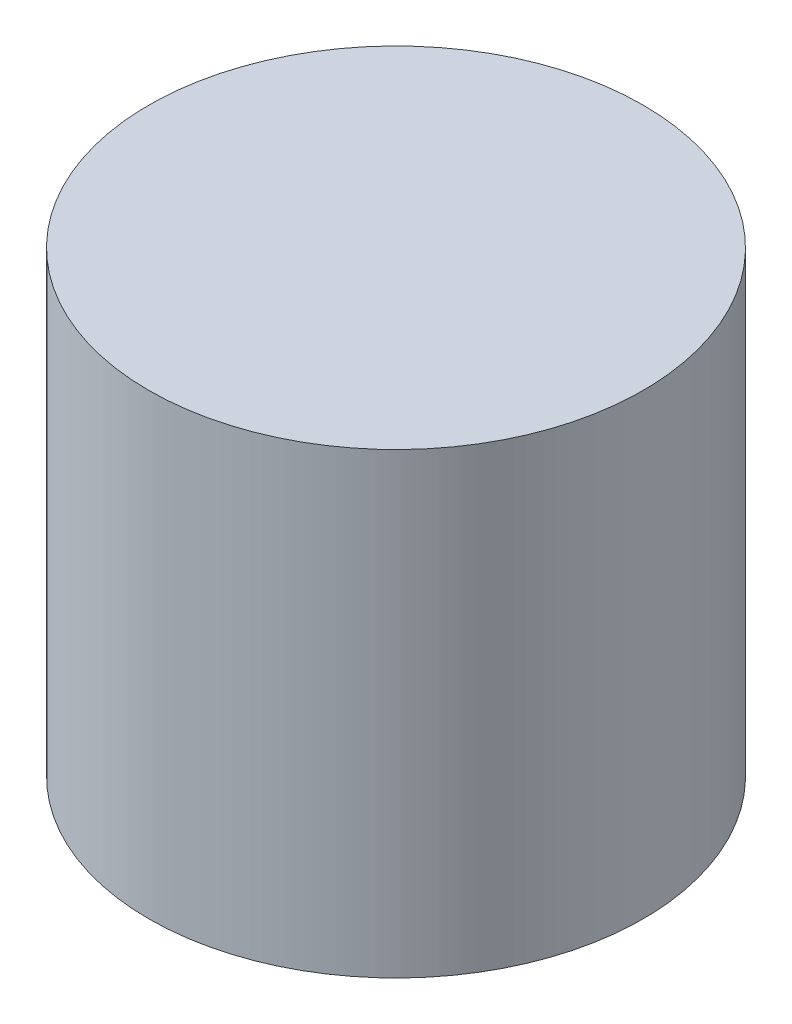
ISO-10303-21;
HEADER;
FILE_DESCRIPTION(('STEP AP214'),'2;1');
FILE_NAME('part.step','',(''),(''),'','','');
FILE_SCHEMA(('AUTOMOTIVE_DESIGN { 1 0 10303 214 1 1 1 1 }'));
ENDSEC;
DATA;
#1=APPLICATION_CONTEXT('core data for automotive mechanical design processes');
#2=APPLICATION_PROTOCOL_DEFINITION('international standard','automotive_design',2000,#1);
#3=PRODUCT_CONTEXT('',#1,'mechanical');
#4=PRODUCT('Part','Part','',(#3));
#5=PRODUCT_RELATED_PRODUCT_CATEGORY('part','',(#4));
#6=PRODUCT_DEFINITION_FORMATION('','',#4);
#7=PRODUCT_DEFINITION_CONTEXT('part definition',#1,'design');
#8=PRODUCT_DEFINITION('design','',#6,#7);
#9=PRODUCT_DEFINITION_SHAPE('','',#8);
#10=(LENGTH_UNIT() NAMED_UNIT(*) SI_UNIT(.MILLI.,.METRE.));
#11=(NAMED_UNIT(*) PLANE_ANGLE_UNIT() SI_UNIT($,.RADIAN.));
#12=(NAMED_UNIT(*) SI_UNIT($,.STERADIAN.) SOLID_ANGLE_UNIT());
#13=UNCERTAINTY_MEASURE_WITH_UNIT(LENGTH_MEASURE(1.E-05),#10,'distance_accuracy_value','');
#14=(GEOMETRIC_REPRESENTATION_CONTEXT(3) GLOBAL_UNCERTAINTY_ASSIGNED_CONTEXT((#13)) GLOBAL_UNIT_ASSIGNED_CONTEXT((#10,
#11,#12)) REPRESENTATION_CONTEXT('',''));
#15=CARTESIAN_POINT('',(0.,0.,0.));
#16=DIRECTION('',(0.,0.,1.));
#17=DIRECTION('',(1.,0.,0.));
#18=AXIS2_PLACEMENT_3D('',#15,#16,#17);
#19=CARTESIAN_POINT('',(0.,50.24,0.));
#20=DIRECTION('',(0.,-1.,0.));
#21=DIRECTION('',(0.,0.,-1.));
#22=AXIS2_PLACEMENT_3D('',#19,#20,#21);
#23=CYLINDRICAL_SURFACE('',#22,27.13);
#24=CARTESIAN_POINT('',(0.,50.24,0.));
#25=DIRECTION('',(0.,1.,0.));
#26=DIRECTION('',(0.,0.,1.));
#27=AXIS2_PLACEMENT_3D('',#24,#25,#26);
#28=CIRCLE('',#27,27.13);
#29=CARTESIAN_POINT('',(0.,50.24,27.13));
#30=VERTEX_POINT('',#29);
#31=EDGE_CURVE('E10',#30,#30,#28,.T.);
#32=ORIENTED_EDGE('',*,*,#31,.F.);
#33=EDGE_LOOP('',(#32));
#34=FACE_BOUND('',#33,.T.);
#35=CARTESIAN_POINT('',(0.,0.,0.));
#36=DIRECTION('',(0.,1.,0.));
#37=DIRECTION('',(0.,0.,1.));
#38=AXIS2_PLACEMENT_3D('',#35,#36,#37);
#39=CIRCLE('',#38,27.13);
#40=CARTESIAN_POINT('',(0.,0.,27.13));
#41=VERTEX_POINT('',#40);
#42=EDGE_CURVE('E40',#41,#41,#39,.T.);
#43=ORIENTED_EDGE('',*,*,#42,.T.);
#44=EDGE_LOOP('',(#43));
#45=FACE_BOUND('',#44,.T.);
#46=ADVANCED_FACE('F37',(#34,#45),#23,.T.);
#47=CARTESIAN_POINT('',(0.,50.24,0.));
#48=DIRECTION('',(0.,1.,0.));
#49=DIRECTION('',(0.,0.,1.));
#50=AXIS2_PLACEMENT_3D('',#47,#48,#49);
#51=PLANE('',#50);
#52=ORIENTED_EDGE('',*,*,#31,.T.);
#53=EDGE_LOOP('',(#52));
#54=FACE_BOUND('',#53,.T.);
#55=ADVANCED_FACE('F54',(#54),#51,.T.);
#56=CARTESIAN_POINT('',(0.,0.,0.));
#57=DIRECTION('',(0.,1.,0.));
#58=DIRECTION('',(0.,0.,1.));
#59=AXIS2_PLACEMENT_3D('',#56,#57,#58);
#60=PLANE('',#59);
#61=ORIENTED_EDGE('',*,*,#42,.F.);
#62=EDGE_LOOP('',(#61));
#63=FACE_BOUND('',#62,.T.);
#64=ADVANCED_FACE('F52',(#63),#60,.F.);
#65=CLOSED_SHELL('',(#46,#55,#64));
#66=MANIFOLD_SOLID_BREP('B2',#65);
#67=ADVANCED_BREP_SHAPE_REPRESENTATION('',(#18,#66),#14);
#68=SHAPE_DEFINITION_REPRESENTATION(#9,#67);
ENDSEC;
END-ISO-10303-21;
